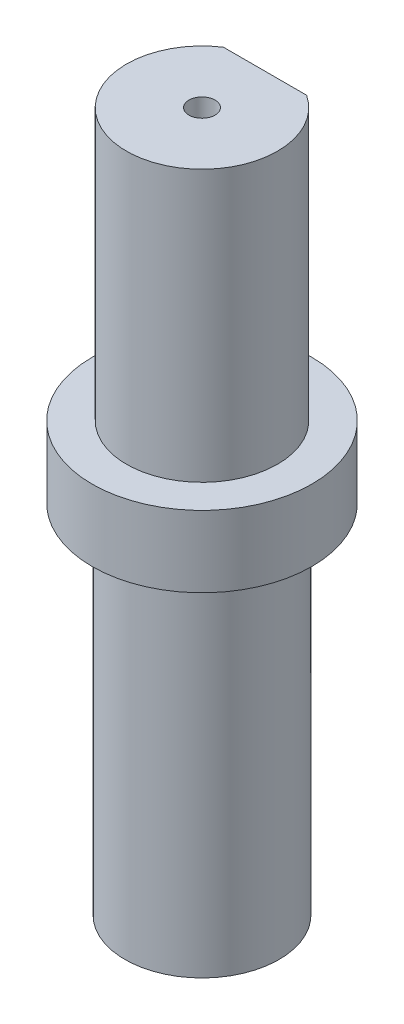
ISO-10303-21;
HEADER;
FILE_DESCRIPTION(('STEP AP214'),'2;1');
FILE_NAME('part.step','',(''),(''),'','','');
FILE_SCHEMA(('AUTOMOTIVE_DESIGN { 1 0 10303 214 1 1 1 1 }'));
ENDSEC;
DATA;
#1=APPLICATION_CONTEXT('core data for automotive mechanical design processes');
#2=APPLICATION_PROTOCOL_DEFINITION('international standard','automotive_design',2000,#1);
#3=PRODUCT_CONTEXT('',#1,'mechanical');
#4=PRODUCT('Part','Part','',(#3));
#5=PRODUCT_RELATED_PRODUCT_CATEGORY('part','',(#4));
#6=PRODUCT_DEFINITION_FORMATION('','',#4);
#7=PRODUCT_DEFINITION_CONTEXT('part definition',#1,'design');
#8=PRODUCT_DEFINITION('design','',#6,#7);
#9=PRODUCT_DEFINITION_SHAPE('','',#8);
#10=(LENGTH_UNIT() NAMED_UNIT(*) SI_UNIT(.MILLI.,.METRE.));
#11=(NAMED_UNIT(*) PLANE_ANGLE_UNIT() SI_UNIT($,.RADIAN.));
#12=(NAMED_UNIT(*) SI_UNIT($,.STERADIAN.) SOLID_ANGLE_UNIT());
#13=UNCERTAINTY_MEASURE_WITH_UNIT(LENGTH_MEASURE(1.E-05),#10,'distance_accuracy_value','');
#14=(GEOMETRIC_REPRESENTATION_CONTEXT(3) GLOBAL_UNCERTAINTY_ASSIGNED_CONTEXT((#13)) GLOBAL_UNIT_ASSIGNED_CONTEXT((#10,
#11,#12)) REPRESENTATION_CONTEXT('',''));
#15=CARTESIAN_POINT('',(0.,0.,0.));
#16=DIRECTION('',(0.,0.,1.));
#17=DIRECTION('',(1.,0.,0.));
#18=AXIS2_PLACEMENT_3D('',#15,#16,#17);
#19=CARTESIAN_POINT('',(3.24,-18.,0.));
#20=DIRECTION('',(0.,-1.,0.));
#21=DIRECTION('',(0.,0.,-1.));
#22=AXIS2_PLACEMENT_3D('',#19,#20,#21);
#23=PLANE('',#22);
#24=CARTESIAN_POINT('',(0.,-18.,0.));
#25=DIRECTION('',(0.,-1.,0.));
#26=DIRECTION('',(0.,0.,-1.));
#27=AXIS2_PLACEMENT_3D('',#24,#25,#26);
#28=CIRCLE('',#27,3.24);
#29=CARTESIAN_POINT('',(0.,-18.,-3.24));
#30=VERTEX_POINT('',#29);
#31=EDGE_CURVE('E74',#30,#30,#28,.T.);
#32=ORIENTED_EDGE('',*,*,#31,.T.);
#33=EDGE_LOOP('',(#32));
#34=FACE_BOUND('',#33,.T.);
#35=CARTESIAN_POINT('',(0.,-18.,0.));
#36=DIRECTION('',(0.,-1.,0.));
#37=DIRECTION('',(0.,0.,-1.));
#38=AXIS2_PLACEMENT_3D('',#35,#36,#37);
#39=CIRCLE('',#38,2.665);
#40=CARTESIAN_POINT('',(0.,-18.,-2.665));
#41=VERTEX_POINT('',#40);
#42=EDGE_CURVE('E11',#41,#41,#39,.T.);
#43=ORIENTED_EDGE('',*,*,#42,.F.);
#44=EDGE_LOOP('',(#43));
#45=FACE_BOUND('',#44,.T.);
#46=ADVANCED_FACE('F37',(#34,#45),#23,.T.);
#47=CARTESIAN_POINT('',(0.,-200.,0.));
#48=DIRECTION('',(0.,-1.,0.));
#49=DIRECTION('',(0.,0.,-1.));
#50=AXIS2_PLACEMENT_3D('',#47,#48,#49);
#51=CYLINDRICAL_SURFACE('',#50,2.665);
#52=ORIENTED_EDGE('',*,*,#42,.T.);
#53=EDGE_LOOP('',(#52));
#54=FACE_BOUND('',#53,.T.);
#55=CARTESIAN_POINT('',(0.,-5.,0.));
#56=DIRECTION('',(0.,-1.,0.));
#57=DIRECTION('',(0.,0.,-1.));
#58=AXIS2_PLACEMENT_3D('',#55,#56,#57);
#59=CIRCLE('',#58,2.665);
#60=CARTESIAN_POINT('',(0.,-5.,-2.665));
#61=VERTEX_POINT('',#60);
#62=EDGE_CURVE('E44',#61,#61,#59,.T.);
#63=ORIENTED_EDGE('',*,*,#62,.F.);
#64=EDGE_LOOP('',(#63));
#65=FACE_BOUND('',#64,.T.);
#66=ADVANCED_FACE('F97',(#54,#65),#51,.F.);
#67=CARTESIAN_POINT('',(2.665,-5.,0.));
#68=DIRECTION('',(0.,-1.,0.));
#69=DIRECTION('',(0.,0.,-1.));
#70=AXIS2_PLACEMENT_3D('',#67,#68,#69);
#71=PLANE('',#70);
#72=ORIENTED_EDGE('',*,*,#62,.T.);
#73=EDGE_LOOP('',(#72));
#74=FACE_BOUND('',#73,.T.);
#75=CARTESIAN_POINT('',(0.,-5.,0.));
#76=DIRECTION('',(0.,-1.,0.));
#77=DIRECTION('',(0.,0.,-1.));
#78=AXIS2_PLACEMENT_3D('',#75,#76,#77);
#79=CIRCLE('',#78,0.55);
#80=CARTESIAN_POINT('',(0.,-5.,-0.55));
#81=VERTEX_POINT('',#80);
#82=EDGE_CURVE('E89',#81,#81,#79,.T.);
#83=ORIENTED_EDGE('',*,*,#82,.F.);
#84=EDGE_LOOP('',(#83));
#85=FACE_BOUND('',#84,.T.);
#86=ADVANCED_FACE('F94',(#74,#85),#71,.T.);
#87=CARTESIAN_POINT('',(0.,-200.,0.));
#88=DIRECTION('',(0.,-1.,0.));
#89=DIRECTION('',(0.,0.,-1.));
#90=AXIS2_PLACEMENT_3D('',#87,#88,#89);
#91=CYLINDRICAL_SURFACE('',#90,0.55);
#92=ORIENTED_EDGE('',*,*,#82,.T.);
#93=EDGE_LOOP('',(#92));
#94=FACE_BOUND('',#93,.T.);
#95=CARTESIAN_POINT('',(0.,11.4,0.));
#96=DIRECTION('',(0.,-1.,0.));
#97=DIRECTION('',(0.,0.,-1.));
#98=AXIS2_PLACEMENT_3D('',#95,#96,#97);
#99=CIRCLE('',#98,0.55);
#100=CARTESIAN_POINT('',(0.,11.4,-0.55));
#101=VERTEX_POINT('',#100);
#102=EDGE_CURVE('E80',#101,#101,#99,.T.);
#103=ORIENTED_EDGE('',*,*,#102,.F.);
#104=EDGE_LOOP('',(#103));
#105=FACE_BOUND('',#104,.T.);
#106=ADVANCED_FACE('F104',(#94,#105),#91,.F.);
#107=CARTESIAN_POINT('',(0.55,11.4,0.));
#108=DIRECTION('',(0.,1.,0.));
#109=DIRECTION('',(0.,0.,1.));
#110=AXIS2_PLACEMENT_3D('',#107,#108,#109);
#111=PLANE('',#110);
#112=DIRECTION('',(-1.,0.,0.));
#113=VECTOR('',#112,1.);
#114=CARTESIAN_POINT('',(4.,11.4,-2.65));
#115=LINE('',#114,#113);
#116=CARTESIAN_POINT('',(1.74874955325227,11.4,-2.65));
#117=VERTEX_POINT('',#116);
#118=CARTESIAN_POINT('',(-1.74874955325227,11.4,-2.65));
#119=VERTEX_POINT('',#118);
#120=EDGE_CURVE('E51',#117,#119,#115,.T.);
#121=ORIENTED_EDGE('',*,*,#120,.T.);
#122=CARTESIAN_POINT('',(0.,11.4,0.));
#123=DIRECTION('',(0.,-1.,0.));
#124=DIRECTION('',(0.,0.,-1.));
#125=AXIS2_PLACEMENT_3D('',#122,#123,#124);
#126=CIRCLE('',#125,3.175);
#127=EDGE_CURVE('E73',#117,#119,#126,.T.);
#128=ORIENTED_EDGE('',*,*,#127,.F.);
#129=EDGE_LOOP('',(#121,#128));
#130=FACE_BOUND('',#129,.T.);
#131=ORIENTED_EDGE('',*,*,#102,.T.);
#132=EDGE_LOOP('',(#131));
#133=FACE_BOUND('',#132,.T.);
#134=ADVANCED_FACE('F110',(#130,#133),#111,.T.);
#135=CARTESIAN_POINT('',(0.,-200.,0.));
#136=DIRECTION('',(0.,-1.,0.));
#137=DIRECTION('',(0.,0.,-1.));
#138=AXIS2_PLACEMENT_3D('',#135,#136,#137);
#139=CYLINDRICAL_SURFACE('',#138,3.175);
#140=DIRECTION('',(0.,-1.,0.));
#141=VECTOR('',#140,1.);
#142=CARTESIAN_POINT('',(-1.74874955325227,-200.,-2.65));
#143=LINE('',#142,#141);
#144=CARTESIAN_POINT('',(-1.74874955325227,0.,-2.65));
#145=VERTEX_POINT('',#144);
#146=EDGE_CURVE('E56',#145,#119,#143,.F.);
#147=ORIENTED_EDGE('',*,*,#146,.F.);
#148=CARTESIAN_POINT('',(0.,0.,0.));
#149=DIRECTION('',(0.,-1.,0.));
#150=DIRECTION('',(0.,0.,-1.));
#151=AXIS2_PLACEMENT_3D('',#148,#149,#150);
#152=CIRCLE('',#151,3.175);
#153=CARTESIAN_POINT('',(1.74874955325227,0.,-2.65));
#154=VERTEX_POINT('',#153);
#155=EDGE_CURVE('E71',#154,#145,#152,.T.);
#156=ORIENTED_EDGE('',*,*,#155,.F.);
#157=DIRECTION('',(0.,-1.,0.));
#158=VECTOR('',#157,1.);
#159=CARTESIAN_POINT('',(1.74874955325227,-200.,-2.65));
#160=LINE('',#159,#158);
#161=EDGE_CURVE('E63',#117,#154,#160,.T.);
#162=ORIENTED_EDGE('',*,*,#161,.F.);
#163=ORIENTED_EDGE('',*,*,#127,.T.);
#164=EDGE_LOOP('',(#147,#156,#162,#163));
#165=FACE_BOUND('',#164,.T.);
#166=ADVANCED_FACE('F70',(#165),#139,.T.);
#167=CARTESIAN_POINT('',(3.175,0.,0.));
#168=DIRECTION('',(0.,1.,0.));
#169=DIRECTION('',(0.,0.,1.));
#170=AXIS2_PLACEMENT_3D('',#167,#168,#169);
#171=PLANE('',#170);
#172=ORIENTED_EDGE('',*,*,#155,.T.);
#173=DIRECTION('',(1.,0.,0.));
#174=VECTOR('',#173,1.);
#175=CARTESIAN_POINT('',(-4.,0.,-2.65));
#176=LINE('',#175,#174);
#177=EDGE_CURVE('E61',#145,#154,#176,.T.);
#178=ORIENTED_EDGE('',*,*,#177,.T.);
#179=EDGE_LOOP('',(#172,#178));
#180=FACE_BOUND('',#179,.T.);
#181=CARTESIAN_POINT('',(0.,0.,0.));
#182=DIRECTION('',(0.,-1.,0.));
#183=DIRECTION('',(0.,0.,-1.));
#184=AXIS2_PLACEMENT_3D('',#181,#182,#183);
#185=CIRCLE('',#184,4.619);
#186=CARTESIAN_POINT('',(0.,0.,-4.619));
#187=VERTEX_POINT('',#186);
#188=EDGE_CURVE('E78',#187,#187,#185,.T.);
#189=ORIENTED_EDGE('',*,*,#188,.F.);
#190=EDGE_LOOP('',(#189));
#191=FACE_BOUND('',#190,.T.);
#192=ADVANCED_FACE('F76',(#180,#191),#171,.T.);
#193=CARTESIAN_POINT('',(0.,-200.,0.));
#194=DIRECTION('',(0.,-1.,0.));
#195=DIRECTION('',(0.,0.,-1.));
#196=AXIS2_PLACEMENT_3D('',#193,#194,#195);
#197=CYLINDRICAL_SURFACE('',#196,4.619);
#198=ORIENTED_EDGE('',*,*,#188,.T.);
#199=EDGE_LOOP('',(#198));
#200=FACE_BOUND('',#199,.T.);
#201=CARTESIAN_POINT('',(0.,-3.,0.));
#202=DIRECTION('',(0.,-1.,0.));
#203=DIRECTION('',(0.,0.,-1.));
#204=AXIS2_PLACEMENT_3D('',#201,#202,#203);
#205=CIRCLE('',#204,4.619);
#206=CARTESIAN_POINT('',(0.,-3.,-4.619));
#207=VERTEX_POINT('',#206);
#208=EDGE_CURVE('E83',#207,#207,#205,.T.);
#209=ORIENTED_EDGE('',*,*,#208,.F.);
#210=EDGE_LOOP('',(#209));
#211=FACE_BOUND('',#210,.T.);
#212=ADVANCED_FACE('F119',(#200,#211),#197,.T.);
#213=CARTESIAN_POINT('',(4.619,-3.,0.));
#214=DIRECTION('',(0.,-1.,0.));
#215=DIRECTION('',(0.,0.,-1.));
#216=AXIS2_PLACEMENT_3D('',#213,#214,#215);
#217=PLANE('',#216);
#218=ORIENTED_EDGE('',*,*,#208,.T.);
#219=EDGE_LOOP('',(#218));
#220=FACE_BOUND('',#219,.T.);
#221=CARTESIAN_POINT('',(0.,-3.,0.));
#222=DIRECTION('',(0.,-1.,0.));
#223=DIRECTION('',(0.,0.,-1.));
#224=AXIS2_PLACEMENT_3D('',#221,#222,#223);
#225=CIRCLE('',#224,3.24);
#226=CARTESIAN_POINT('',(0.,-3.,-3.24));
#227=VERTEX_POINT('',#226);
#228=EDGE_CURVE('E202',#227,#227,#225,.T.);
#229=ORIENTED_EDGE('',*,*,#228,.F.);
#230=EDGE_LOOP('',(#229));
#231=FACE_BOUND('',#230,.T.);
#232=ADVANCED_FACE('F122',(#220,#231),#217,.T.);
#233=CARTESIAN_POINT('',(0.,-200.,0.));
#234=DIRECTION('',(0.,-1.,0.));
#235=DIRECTION('',(0.,0.,-1.));
#236=AXIS2_PLACEMENT_3D('',#233,#234,#235);
#237=CYLINDRICAL_SURFACE('',#236,3.24);
#238=ORIENTED_EDGE('',*,*,#228,.T.);
#239=EDGE_LOOP('',(#238));
#240=FACE_BOUND('',#239,.T.);
#241=ORIENTED_EDGE('',*,*,#31,.F.);
#242=EDGE_LOOP('',(#241));
#243=FACE_BOUND('',#242,.T.);
#244=ADVANCED_FACE('F126',(#240,#243),#237,.T.);
#245=CARTESIAN_POINT('',(0.,0.,-2.65));
#246=DIRECTION('',(0.,0.,1.));
#247=DIRECTION('',(1.,0.,0.));
#248=AXIS2_PLACEMENT_3D('',#245,#246,#247);
#249=PLANE('',#248);
#250=ORIENTED_EDGE('',*,*,#146,.T.);
#251=ORIENTED_EDGE('',*,*,#120,.F.);
#252=ORIENTED_EDGE('',*,*,#161,.T.);
#253=ORIENTED_EDGE('',*,*,#177,.F.);
#254=EDGE_LOOP('',(#250,#251,#252,#253));
#255=FACE_BOUND('',#254,.T.);
#256=ADVANCED_FACE('F62',(#255),#249,.F.);
#257=CLOSED_SHELL('',(#46,#66,#86,#106,#134,#166,#192,#212,#232,#244,#256));
#258=MANIFOLD_SOLID_BREP('B2',#257);
#259=ADVANCED_BREP_SHAPE_REPRESENTATION('',(#18,#258),#14);
#260=SHAPE_DEFINITION_REPRESENTATION(#9,#259);
ENDSEC;
END-ISO-10303-21;
